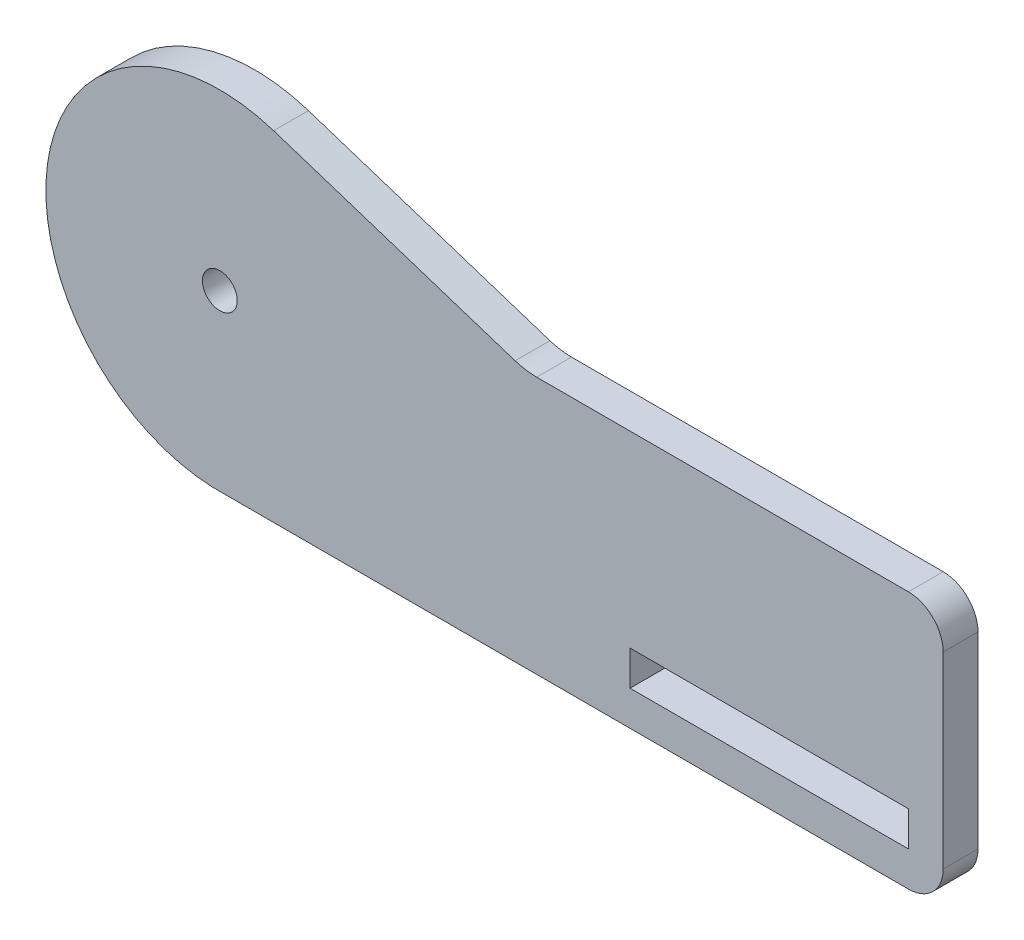
ISO-10303-21;
HEADER;
FILE_DESCRIPTION(('STEP AP214'),'2;1');
FILE_NAME('part.step','',(''),(''),'','','');
FILE_SCHEMA(('AUTOMOTIVE_DESIGN { 1 0 10303 214 1 1 1 1 }'));
ENDSEC;
DATA;
#1=APPLICATION_CONTEXT('core data for automotive mechanical design processes');
#2=APPLICATION_PROTOCOL_DEFINITION('international standard','automotive_design',2000,#1);
#3=PRODUCT_CONTEXT('',#1,'mechanical');
#4=PRODUCT('Part','Part','',(#3));
#5=PRODUCT_RELATED_PRODUCT_CATEGORY('part','',(#4));
#6=PRODUCT_DEFINITION_FORMATION('','',#4);
#7=PRODUCT_DEFINITION_CONTEXT('part definition',#1,'design');
#8=PRODUCT_DEFINITION('design','',#6,#7);
#9=PRODUCT_DEFINITION_SHAPE('','',#8);
#10=(LENGTH_UNIT() NAMED_UNIT(*) SI_UNIT(.MILLI.,.METRE.));
#11=(NAMED_UNIT(*) PLANE_ANGLE_UNIT() SI_UNIT($,.RADIAN.));
#12=(NAMED_UNIT(*) SI_UNIT($,.STERADIAN.) SOLID_ANGLE_UNIT());
#13=UNCERTAINTY_MEASURE_WITH_UNIT(LENGTH_MEASURE(1.E-05),#10,'distance_accuracy_value','');
#14=(GEOMETRIC_REPRESENTATION_CONTEXT(3) GLOBAL_UNCERTAINTY_ASSIGNED_CONTEXT((#13)) GLOBAL_UNIT_ASSIGNED_CONTEXT((#10,
#11,#12)) REPRESENTATION_CONTEXT('',''));
#15=CARTESIAN_POINT('',(0.,0.,0.));
#16=DIRECTION('',(0.,0.,1.));
#17=DIRECTION('',(1.,0.,0.));
#18=AXIS2_PLACEMENT_3D('',#15,#16,#17);
#19=CARTESIAN_POINT('',(78.9414830868261,11.9999983011994,2.5));
#20=DIRECTION('',(5.52135524800601E-08,-0.999999999999999,0.));
#21=DIRECTION('',(0.999999999999999,5.52135524800601E-08,0.));
#22=AXIS2_PLACEMENT_3D('',#19,#20,#21);
#23=PLANE('',#22);
#24=DIRECTION('',(-0.999999999999998,-5.52135524800601E-08,0.));
#25=VECTOR('',#24,1.);
#26=CARTESIAN_POINT('',(78.9414830868261,11.9999983011994,2.5));
#27=LINE('',#26,#25);
#28=CARTESIAN_POINT('',(73.9414834212097,11.9999980251316,2.5));
#29=VERTEX_POINT('',#28);
#30=CARTESIAN_POINT('',(20.5264933913357,11.9999950759003,2.5));
#31=VERTEX_POINT('',#30);
#32=EDGE_CURVE('E160',#29,#31,#27,.T.);
#33=ORIENTED_EDGE('',*,*,#32,.F.);
#34=DIRECTION('',(0.,0.,-1.));
#35=VECTOR('',#34,1.);
#36=CARTESIAN_POINT('',(73.9414834212097,11.9999980251316,2.5));
#37=LINE('',#36,#35);
#38=CARTESIAN_POINT('',(73.9414834212097,11.9999980251316,-2.5));
#39=VERTEX_POINT('',#38);
#40=EDGE_CURVE('E219',#29,#39,#37,.T.);
#41=ORIENTED_EDGE('',*,*,#40,.T.);
#42=DIRECTION('',(-0.999999999999998,-5.52135524800601E-08,0.));
#43=VECTOR('',#42,1.);
#44=CARTESIAN_POINT('',(78.9414830868261,11.9999983011994,-2.5));
#45=LINE('',#44,#43);
#46=CARTESIAN_POINT('',(20.5264933913357,11.9999950759003,-2.5));
#47=VERTEX_POINT('',#46);
#48=EDGE_CURVE('E176',#39,#47,#45,.T.);
#49=ORIENTED_EDGE('',*,*,#48,.T.);
#50=DIRECTION('',(0.,0.,-1.));
#51=VECTOR('',#50,1.);
#52=CARTESIAN_POINT('',(20.5264933913357,11.9999950759003,2.5));
#53=LINE('',#52,#51);
#54=EDGE_CURVE('E194',#47,#31,#53,.F.);
#55=ORIENTED_EDGE('',*,*,#54,.T.);
#56=EDGE_LOOP('',(#33,#41,#49,#55));
#57=FACE_BOUND('',#56,.T.);
#58=ADVANCED_FACE('F30',(#57),#23,.F.);
#59=CARTESIAN_POINT('',(18.9414830868262,11.9999949883862,2.5));
#60=DIRECTION('',(-0.309233270532532,-0.950986216722279,0.));
#61=DIRECTION('',(0.950986216722279,-0.309233270532532,0.));
#62=AXIS2_PLACEMENT_3D('',#59,#60,#61);
#63=PLANE('',#62);
#64=DIRECTION('',(-0.950986216722279,0.309233270532532,0.));
#65=VECTOR('',#64,1.);
#66=CARTESIAN_POINT('',(18.9414830868262,11.9999949883862,2.5));
#67=LINE('',#66,#65);
#68=CARTESIAN_POINT('',(17.4341601338748,12.4901329086775,2.5));
#69=VERTEX_POINT('',#68);
#70=CARTESIAN_POINT('',(-17.2691683086149,23.774653718688,2.5));
#71=VERTEX_POINT('',#70);
#72=EDGE_CURVE('E163',#69,#71,#67,.T.);
#73=ORIENTED_EDGE('',*,*,#72,.F.);
#74=DIRECTION('',(0.,0.,-1.));
#75=VECTOR('',#74,1.);
#76=CARTESIAN_POINT('',(17.4341601338748,12.4901329086775,-2.5));
#77=LINE('',#76,#75);
#78=CARTESIAN_POINT('',(17.4341601338748,12.4901329086775,-2.5));
#79=VERTEX_POINT('',#78);
#80=EDGE_CURVE('E191',#69,#79,#77,.T.);
#81=ORIENTED_EDGE('',*,*,#80,.T.);
#82=DIRECTION('',(-0.950986216722279,0.309233270532532,0.));
#83=VECTOR('',#82,1.);
#84=CARTESIAN_POINT('',(18.9414830868262,11.9999949883862,-2.5));
#85=LINE('',#84,#83);
#86=CARTESIAN_POINT('',(-17.2691683086149,23.774653718688,-2.5));
#87=VERTEX_POINT('',#86);
#88=EDGE_CURVE('E178',#79,#87,#85,.T.);
#89=ORIENTED_EDGE('',*,*,#88,.T.);
#90=DIRECTION('',(0.,0.,-1.));
#91=VECTOR('',#90,1.);
#92=CARTESIAN_POINT('',(-17.2691683086149,23.774653718688,2.5));
#93=LINE('',#92,#91);
#94=EDGE_CURVE('E188',#71,#87,#93,.T.);
#95=ORIENTED_EDGE('',*,*,#94,.F.);
#96=EDGE_LOOP('',(#73,#81,#89,#95));
#97=FACE_BOUND('',#96,.T.);
#98=ADVANCED_FACE('F244',(#97),#63,.F.);
#99=CARTESIAN_POINT('',(-25.0000000783611,-1.69727719292329E-06,2.5));
#100=DIRECTION('',(0.,0.,-1.));
#101=DIRECTION('',(-1.,0.,0.));
#102=AXIS2_PLACEMENT_3D('',#99,#100,#101);
#103=CYLINDRICAL_SURFACE('',#102,25.);
#104=CARTESIAN_POINT('',(-25.0000000783611,-1.69727719292329E-06,-2.5));
#105=DIRECTION('',(0.,0.,1.));
#106=DIRECTION('',(1.,0.,0.));
#107=AXIS2_PLACEMENT_3D('',#104,#105,#106);
#108=CIRCLE('',#107,25.);
#109=CARTESIAN_POINT('',(-26.058513909316,-24.9775826143652,-2.5));
#110=VERTEX_POINT('',#109);
#111=EDGE_CURVE('E180',#87,#110,#108,.T.);
#112=ORIENTED_EDGE('',*,*,#111,.T.);
#113=DIRECTION('',(0.,0.,-1.));
#114=VECTOR('',#113,1.);
#115=CARTESIAN_POINT('',(-26.058513909316,-24.9775826143652,2.5));
#116=LINE('',#115,#114);
#117=CARTESIAN_POINT('',(-26.058513909316,-24.9775826143652,2.5));
#118=VERTEX_POINT('',#117);
#119=EDGE_CURVE('E172',#118,#110,#116,.T.);
#120=ORIENTED_EDGE('',*,*,#119,.F.);
#121=CARTESIAN_POINT('',(-25.0000000783611,-1.69727719292329E-06,2.5));
#122=DIRECTION('',(0.,0.,1.));
#123=DIRECTION('',(1.,0.,0.));
#124=AXIS2_PLACEMENT_3D('',#121,#122,#123);
#125=CIRCLE('',#124,25.);
#126=EDGE_CURVE('E165',#71,#118,#125,.T.);
#127=ORIENTED_EDGE('',*,*,#126,.F.);
#128=ORIENTED_EDGE('',*,*,#94,.T.);
#129=EDGE_LOOP('',(#112,#120,#127,#128));
#130=FACE_BOUND('',#129,.T.);
#131=ADVANCED_FACE('F250',(#130),#103,.T.);
#132=CARTESIAN_POINT('',(-26.058513909316,-24.9775826143652,2.5));
#133=DIRECTION('',(0.000213515089861503,0.999999977205653,0.));
#134=DIRECTION('',(-0.999999977205653,0.000213515089861503,0.));
#135=AXIS2_PLACEMENT_3D('',#132,#133,#134);
#136=PLANE('',#135);
#137=DIRECTION('',(0.999999977205653,-0.000213515089861503,0.));
#138=VECTOR('',#137,1.);
#139=CARTESIAN_POINT('',(-26.058513909316,-24.9775826143652,-2.5));
#140=LINE('',#139,#138);
#141=CARTESIAN_POINT('',(73.9404161218282,-24.9989338953835,-2.5));
#142=VERTEX_POINT('',#141);
#143=EDGE_CURVE('E182',#110,#142,#140,.T.);
#144=ORIENTED_EDGE('',*,*,#143,.T.);
#145=DIRECTION('',(0.,0.,-1.));
#146=VECTOR('',#145,1.);
#147=CARTESIAN_POINT('',(73.9404161218282,-24.9989338953835,2.5));
#148=LINE('',#147,#146);
#149=CARTESIAN_POINT('',(73.9404161218282,-24.9989338953835,2.5));
#150=VERTEX_POINT('',#149);
#151=EDGE_CURVE('E213',#142,#150,#148,.F.);
#152=ORIENTED_EDGE('',*,*,#151,.T.);
#153=DIRECTION('',(0.999999977205653,-0.000213515089861503,0.));
#154=VECTOR('',#153,1.);
#155=CARTESIAN_POINT('',(-26.058513909316,-24.9775826143652,2.5));
#156=LINE('',#155,#154);
#157=EDGE_CURVE('E167',#118,#150,#156,.T.);
#158=ORIENTED_EDGE('',*,*,#157,.F.);
#159=ORIENTED_EDGE('',*,*,#119,.T.);
#160=EDGE_LOOP('',(#144,#152,#158,#159));
#161=FACE_BOUND('',#160,.T.);
#162=ADVANCED_FACE('F294',(#161),#136,.F.);
#163=CARTESIAN_POINT('',(78.9414836972775,-25.0000016988006,2.5));
#164=DIRECTION('',(-1.,0.,0.));
#165=DIRECTION('',(0.,0.,1.));
#166=AXIS2_PLACEMENT_3D('',#163,#164,#165);
#167=PLANE('',#166);
#168=DIRECTION('',(0.,1.,0.));
#169=VECTOR('',#168,1.);
#170=CARTESIAN_POINT('',(78.9414836972775,-25.0000016988006,2.5));
#171=LINE('',#170,#169);
#172=CARTESIAN_POINT('',(78.9414836972775,-19.9989340093552,2.5));
#173=VERTEX_POINT('',#172);
#174=CARTESIAN_POINT('',(78.9414836972775,-1.69880061571916E-06,2.5));
#175=VERTEX_POINT('',#174);
#176=EDGE_CURVE('E170',#173,#175,#171,.T.);
#177=ORIENTED_EDGE('',*,*,#176,.F.);
#178=DIRECTION('',(0.,0.,-1.));
#179=VECTOR('',#178,1.);
#180=CARTESIAN_POINT('',(78.9414836972775,-19.9989340093552,2.5));
#181=LINE('',#180,#179);
#182=CARTESIAN_POINT('',(78.9414836972775,-19.9989340093552,-2.5));
#183=VERTEX_POINT('',#182);
#184=EDGE_CURVE('E206',#173,#183,#181,.T.);
#185=ORIENTED_EDGE('',*,*,#184,.T.);
#186=DIRECTION('',(0.,1.,0.));
#187=VECTOR('',#186,1.);
#188=CARTESIAN_POINT('',(78.9414836972775,-25.0000016988006,-2.5));
#189=LINE('',#188,#187);
#190=CARTESIAN_POINT('',(78.9414836972775,-1.69880061571916E-06,-2.5));
#191=VERTEX_POINT('',#190);
#192=EDGE_CURVE('E161',#183,#191,#189,.T.);
#193=ORIENTED_EDGE('',*,*,#192,.T.);
#194=DIRECTION('',(-5.08709532831553E-08,0.999999999999999,0.));
#195=VECTOR('',#194,1.);
#196=CARTESIAN_POINT('',(78.9414836972775,-1.69880061571916E-06,-2.5));
#197=LINE('',#196,#195);
#198=CARTESIAN_POINT('',(78.9414833411809,6.99999802513161,-2.5));
#199=VERTEX_POINT('',#198);
#200=EDGE_CURVE('E173',#191,#199,#197,.T.);
#201=ORIENTED_EDGE('',*,*,#200,.T.);
#202=DIRECTION('',(0.,0.,-1.));
#203=VECTOR('',#202,1.);
#204=CARTESIAN_POINT('',(78.9414836972775,6.99999802513163,2.5));
#205=LINE('',#204,#203);
#206=CARTESIAN_POINT('',(78.9414833411809,6.99999802513161,2.5));
#207=VERTEX_POINT('',#206);
#208=EDGE_CURVE('E202',#199,#207,#205,.F.);
#209=ORIENTED_EDGE('',*,*,#208,.T.);
#210=DIRECTION('',(-5.08709532831553E-08,0.999999999999999,0.));
#211=VECTOR('',#210,1.);
#212=CARTESIAN_POINT('',(78.9414836972775,-1.69880061571916E-06,2.5));
#213=LINE('',#212,#211);
#214=EDGE_CURVE('E157',#175,#207,#213,.T.);
#215=ORIENTED_EDGE('',*,*,#214,.F.);
#216=EDGE_LOOP('',(#177,#185,#193,#201,#209,#215));
#217=FACE_BOUND('',#216,.T.);
#218=ADVANCED_FACE('F274',(#217),#167,.F.);
#219=CARTESIAN_POINT('',(-25.0000000783611,-1.69727719292329E-06,2.5));
#220=DIRECTION('',(0.,0.,1.));
#221=DIRECTION('',(1.,0.,0.));
#222=AXIS2_PLACEMENT_3D('',#219,#220,#221);
#223=PLANE('',#222);
#224=DIRECTION('',(0.,1.,0.));
#225=VECTOR('',#224,1.);
#226=CARTESIAN_POINT('',(73.9414836972775,-19.9989340093552,2.5));
#227=LINE('',#226,#225);
#228=CARTESIAN_POINT('',(73.9414836972775,-19.9989340093552,2.5));
#229=VERTEX_POINT('',#228);
#230=CARTESIAN_POINT('',(73.9414836972775,-14.9989340093552,2.5));
#231=VERTEX_POINT('',#230);
#232=EDGE_CURVE('E45',#229,#231,#227,.T.);
#233=ORIENTED_EDGE('',*,*,#232,.F.);
#234=DIRECTION('',(1.,0.,0.));
#235=VECTOR('',#234,1.);
#236=CARTESIAN_POINT('',(73.9414836972775,-19.9989340093552,2.5));
#237=LINE('',#236,#235);
#238=CARTESIAN_POINT('',(33.9414836972775,-19.9989340093552,2.5));
#239=VERTEX_POINT('',#238);
#240=EDGE_CURVE('E144',#239,#229,#237,.T.);
#241=ORIENTED_EDGE('',*,*,#240,.F.);
#242=DIRECTION('',(0.,-1.,0.));
#243=VECTOR('',#242,1.);
#244=CARTESIAN_POINT('',(33.9414836972775,-19.9989340093552,2.5));
#245=LINE('',#244,#243);
#246=CARTESIAN_POINT('',(33.9414836972775,-14.9989340093552,2.5));
#247=VERTEX_POINT('',#246);
#248=EDGE_CURVE('E128',#247,#239,#245,.T.);
#249=ORIENTED_EDGE('',*,*,#248,.F.);
#250=DIRECTION('',(-1.,0.,0.));
#251=VECTOR('',#250,1.);
#252=CARTESIAN_POINT('',(33.9414836972775,-14.9989340093552,2.5));
#253=LINE('',#252,#251);
#254=EDGE_CURVE('E137',#231,#247,#253,.T.);
#255=ORIENTED_EDGE('',*,*,#254,.F.);
#256=EDGE_LOOP('',(#233,#241,#249,#255));
#257=FACE_BOUND('',#256,.T.);
#258=CARTESIAN_POINT('',(-25.0000000783611,-1.69727719292329E-06,2.5));
#259=DIRECTION('',(0.,0.,1.));
#260=DIRECTION('',(1.,0.,0.));
#261=AXIS2_PLACEMENT_3D('',#258,#259,#260);
#262=CIRCLE('',#261,2.5);
#263=CARTESIAN_POINT('',(-22.5000000783611,-1.69727719292329E-06,2.5));
#264=VERTEX_POINT('',#263);
#265=EDGE_CURVE('E151',#264,#264,#262,.T.);
#266=ORIENTED_EDGE('',*,*,#265,.F.);
#267=EDGE_LOOP('',(#266));
#268=FACE_BOUND('',#267,.T.);
#269=ORIENTED_EDGE('',*,*,#157,.T.);
#270=CARTESIAN_POINT('',(73.9414836972775,-19.9989340093552,2.5));
#271=DIRECTION('',(0.,0.,1.));
#272=DIRECTION('',(1.,0.,0.));
#273=AXIS2_PLACEMENT_3D('',#270,#271,#272);
#274=CIRCLE('',#273,5.);
#275=EDGE_CURVE('E217',#150,#173,#274,.T.);
#276=ORIENTED_EDGE('',*,*,#275,.T.);
#277=ORIENTED_EDGE('',*,*,#176,.T.);
#278=ORIENTED_EDGE('',*,*,#214,.T.);
#279=CARTESIAN_POINT('',(73.9414836972775,6.99999802513163,2.5));
#280=DIRECTION('',(0.,0.,1.));
#281=DIRECTION('',(1.,0.,0.));
#282=AXIS2_PLACEMENT_3D('',#279,#280,#281);
#283=CIRCLE('',#282,5.);
#284=EDGE_CURVE('E215',#207,#29,#283,.T.);
#285=ORIENTED_EDGE('',*,*,#284,.T.);
#286=ORIENTED_EDGE('',*,*,#32,.T.);
#287=CARTESIAN_POINT('',(20.5264928392001,21.9999950759003,2.5));
#288=DIRECTION('',(0.,0.,1.));
#289=DIRECTION('',(1.,0.,0.));
#290=AXIS2_PLACEMENT_3D('',#287,#288,#289);
#291=CIRCLE('',#290,10.);
#292=EDGE_CURVE('E200',#31,#69,#291,.F.);
#293=ORIENTED_EDGE('',*,*,#292,.T.);
#294=ORIENTED_EDGE('',*,*,#72,.T.);
#295=ORIENTED_EDGE('',*,*,#126,.T.);
#296=EDGE_LOOP('',(#269,#276,#277,#278,#285,#286,#293,#294,#295));
#297=FACE_BOUND('',#296,.T.);
#298=ADVANCED_FACE('F141',(#257,#268,#297),#223,.T.);
#299=CARTESIAN_POINT('',(-25.0000000783611,-1.69727719292329E-06,-2.5));
#300=DIRECTION('',(0.,0.,1.));
#301=DIRECTION('',(1.,0.,0.));
#302=AXIS2_PLACEMENT_3D('',#299,#300,#301);
#303=PLANE('',#302);
#304=DIRECTION('',(1.,0.,0.));
#305=VECTOR('',#304,1.);
#306=CARTESIAN_POINT('',(-25.0000000783611,-19.9989340093552,-2.5));
#307=LINE('',#306,#305);
#308=CARTESIAN_POINT('',(33.9414836972775,-19.9989340093552,-2.5));
#309=VERTEX_POINT('',#308);
#310=CARTESIAN_POINT('',(73.9414836972775,-19.9989340093552,-2.5));
#311=VERTEX_POINT('',#310);
#312=EDGE_CURVE('E38',#309,#311,#307,.T.);
#313=ORIENTED_EDGE('',*,*,#312,.T.);
#314=DIRECTION('',(0.,1.,0.));
#315=VECTOR('',#314,1.);
#316=CARTESIAN_POINT('',(73.9414836972775,-1.69727719292329E-06,-2.5));
#317=LINE('',#316,#315);
#318=CARTESIAN_POINT('',(73.9414836972775,-14.9989340093552,-2.5));
#319=VERTEX_POINT('',#318);
#320=EDGE_CURVE('E11',#311,#319,#317,.T.);
#321=ORIENTED_EDGE('',*,*,#320,.T.);
#322=DIRECTION('',(-1.,0.,0.));
#323=VECTOR('',#322,1.);
#324=CARTESIAN_POINT('',(-25.0000000783611,-14.9989340093552,-2.5));
#325=LINE('',#324,#323);
#326=CARTESIAN_POINT('',(33.9414836972775,-14.9989340093552,-2.5));
#327=VERTEX_POINT('',#326);
#328=EDGE_CURVE('E222',#319,#327,#325,.T.);
#329=ORIENTED_EDGE('',*,*,#328,.T.);
#330=DIRECTION('',(0.,-1.,0.));
#331=VECTOR('',#330,1.);
#332=CARTESIAN_POINT('',(33.9414836972775,-1.69727719292329E-06,-2.5));
#333=LINE('',#332,#331);
#334=EDGE_CURVE('E131',#327,#309,#333,.T.);
#335=ORIENTED_EDGE('',*,*,#334,.T.);
#336=EDGE_LOOP('',(#313,#321,#329,#335));
#337=FACE_BOUND('',#336,.T.);
#338=CARTESIAN_POINT('',(-25.0000000783611,-1.69727719292329E-06,-2.5));
#339=DIRECTION('',(0.,0.,1.));
#340=DIRECTION('',(1.,0.,0.));
#341=AXIS2_PLACEMENT_3D('',#338,#339,#340);
#342=CIRCLE('',#341,2.5);
#343=CARTESIAN_POINT('',(-22.5000000783611,-1.69727719292329E-06,-2.5));
#344=VERTEX_POINT('',#343);
#345=EDGE_CURVE('E156',#344,#344,#342,.T.);
#346=ORIENTED_EDGE('',*,*,#345,.T.);
#347=EDGE_LOOP('',(#346));
#348=FACE_BOUND('',#347,.T.);
#349=ORIENTED_EDGE('',*,*,#192,.F.);
#350=CARTESIAN_POINT('',(73.9414836972775,-19.9989340093552,-2.5));
#351=DIRECTION('',(0.,0.,1.));
#352=DIRECTION('',(1.,0.,0.));
#353=AXIS2_PLACEMENT_3D('',#350,#351,#352);
#354=CIRCLE('',#353,5.);
#355=EDGE_CURVE('E211',#183,#142,#354,.F.);
#356=ORIENTED_EDGE('',*,*,#355,.T.);
#357=ORIENTED_EDGE('',*,*,#143,.F.);
#358=ORIENTED_EDGE('',*,*,#111,.F.);
#359=ORIENTED_EDGE('',*,*,#88,.F.);
#360=CARTESIAN_POINT('',(20.5264928392001,21.9999950759003,-2.5));
#361=DIRECTION('',(0.,0.,1.));
#362=DIRECTION('',(1.,0.,0.));
#363=AXIS2_PLACEMENT_3D('',#360,#361,#362);
#364=CIRCLE('',#363,10.);
#365=EDGE_CURVE('E197',#79,#47,#364,.T.);
#366=ORIENTED_EDGE('',*,*,#365,.T.);
#367=ORIENTED_EDGE('',*,*,#48,.F.);
#368=CARTESIAN_POINT('',(73.9414836972775,6.99999802513163,-2.5));
#369=DIRECTION('',(0.,0.,1.));
#370=DIRECTION('',(1.,0.,0.));
#371=AXIS2_PLACEMENT_3D('',#368,#369,#370);
#372=CIRCLE('',#371,5.);
#373=EDGE_CURVE('E209',#39,#199,#372,.F.);
#374=ORIENTED_EDGE('',*,*,#373,.T.);
#375=ORIENTED_EDGE('',*,*,#200,.F.);
#376=EDGE_LOOP('',(#349,#356,#357,#358,#359,#366,#367,#374,#375));
#377=FACE_BOUND('',#376,.T.);
#378=ADVANCED_FACE('F226',(#337,#348,#377),#303,.F.);
#379=CARTESIAN_POINT('',(20.5264928392001,21.9999950759003,2.5));
#380=DIRECTION('',(0.,0.,1.));
#381=DIRECTION('',(1.,0.,0.));
#382=AXIS2_PLACEMENT_3D('',#379,#380,#381);
#383=CYLINDRICAL_SURFACE('',#382,10.);
#384=ORIENTED_EDGE('',*,*,#292,.F.);
#385=ORIENTED_EDGE('',*,*,#54,.F.);
#386=ORIENTED_EDGE('',*,*,#365,.F.);
#387=ORIENTED_EDGE('',*,*,#80,.F.);
#388=EDGE_LOOP('',(#384,#385,#386,#387));
#389=FACE_BOUND('',#388,.T.);
#390=ADVANCED_FACE('F256',(#389),#383,.F.);
#391=CARTESIAN_POINT('',(-25.0000000783611,-1.69727719292329E-06,-7.5));
#392=DIRECTION('',(0.,0.,1.));
#393=DIRECTION('',(1.,0.,0.));
#394=AXIS2_PLACEMENT_3D('',#391,#392,#393);
#395=CYLINDRICAL_SURFACE('',#394,2.5);
#396=ORIENTED_EDGE('',*,*,#265,.T.);
#397=EDGE_LOOP('',(#396));
#398=FACE_BOUND('',#397,.T.);
#399=ORIENTED_EDGE('',*,*,#345,.F.);
#400=EDGE_LOOP('',(#399));
#401=FACE_BOUND('',#400,.T.);
#402=ADVANCED_FACE('F258',(#398,#401),#395,.F.);
#403=CARTESIAN_POINT('',(73.9414836972775,-19.9989340093552,2.5));
#404=DIRECTION('',(0.,0.,-1.));
#405=DIRECTION('',(-1.,0.,0.));
#406=AXIS2_PLACEMENT_3D('',#403,#404,#405);
#407=CYLINDRICAL_SURFACE('',#406,5.);
#408=ORIENTED_EDGE('',*,*,#275,.F.);
#409=ORIENTED_EDGE('',*,*,#151,.F.);
#410=ORIENTED_EDGE('',*,*,#355,.F.);
#411=ORIENTED_EDGE('',*,*,#184,.F.);
#412=EDGE_LOOP('',(#408,#409,#410,#411));
#413=FACE_BOUND('',#412,.T.);
#414=ADVANCED_FACE('F239',(#413),#407,.T.);
#415=CARTESIAN_POINT('',(73.9414836972775,6.99999802513163,2.5));
#416=DIRECTION('',(0.,0.,-1.));
#417=DIRECTION('',(-1.,0.,0.));
#418=AXIS2_PLACEMENT_3D('',#415,#416,#417);
#419=CYLINDRICAL_SURFACE('',#418,5.);
#420=ORIENTED_EDGE('',*,*,#284,.F.);
#421=ORIENTED_EDGE('',*,*,#208,.F.);
#422=ORIENTED_EDGE('',*,*,#373,.F.);
#423=ORIENTED_EDGE('',*,*,#40,.F.);
#424=EDGE_LOOP('',(#420,#421,#422,#423));
#425=FACE_BOUND('',#424,.T.);
#426=ADVANCED_FACE('F32',(#425),#419,.T.);
#427=CARTESIAN_POINT('',(73.9414836972775,-19.9989340093552,-7.5));
#428=DIRECTION('',(1.,0.,0.));
#429=DIRECTION('',(0.,0.,-1.));
#430=AXIS2_PLACEMENT_3D('',#427,#428,#429);
#431=PLANE('',#430);
#432=DIRECTION('',(0.,0.,1.));
#433=VECTOR('',#432,1.);
#434=CARTESIAN_POINT('',(73.9414836972775,-19.9989340093552,-7.5));
#435=LINE('',#434,#433);
#436=EDGE_CURVE('E149',#311,#229,#435,.T.);
#437=ORIENTED_EDGE('',*,*,#436,.T.);
#438=ORIENTED_EDGE('',*,*,#232,.T.);
#439=DIRECTION('',(0.,0.,1.));
#440=VECTOR('',#439,1.);
#441=CARTESIAN_POINT('',(73.9414836972775,-14.9989340093552,-7.5));
#442=LINE('',#441,#440);
#443=EDGE_CURVE('E134',#319,#231,#442,.T.);
#444=ORIENTED_EDGE('',*,*,#443,.F.);
#445=ORIENTED_EDGE('',*,*,#320,.F.);
#446=EDGE_LOOP('',(#437,#438,#444,#445));
#447=FACE_BOUND('',#446,.T.);
#448=ADVANCED_FACE('F231',(#447),#431,.F.);
#449=CARTESIAN_POINT('',(73.9414836972775,-19.9989340093552,-7.5));
#450=DIRECTION('',(0.,-1.,0.));
#451=DIRECTION('',(0.,0.,-1.));
#452=AXIS2_PLACEMENT_3D('',#449,#450,#451);
#453=PLANE('',#452);
#454=DIRECTION('',(0.,0.,1.));
#455=VECTOR('',#454,1.);
#456=CARTESIAN_POINT('',(33.9414836972775,-19.9989340093552,-7.5));
#457=LINE('',#456,#455);
#458=EDGE_CURVE('E133',#309,#239,#457,.T.);
#459=ORIENTED_EDGE('',*,*,#458,.T.);
#460=ORIENTED_EDGE('',*,*,#240,.T.);
#461=ORIENTED_EDGE('',*,*,#436,.F.);
#462=ORIENTED_EDGE('',*,*,#312,.F.);
#463=EDGE_LOOP('',(#459,#460,#461,#462));
#464=FACE_BOUND('',#463,.T.);
#465=ADVANCED_FACE('F230',(#464),#453,.F.);
#466=CARTESIAN_POINT('',(33.9414836972775,-19.9989340093552,-7.5));
#467=DIRECTION('',(-1.,0.,0.));
#468=DIRECTION('',(0.,0.,1.));
#469=AXIS2_PLACEMENT_3D('',#466,#467,#468);
#470=PLANE('',#469);
#471=DIRECTION('',(0.,0.,1.));
#472=VECTOR('',#471,1.);
#473=CARTESIAN_POINT('',(33.9414836972775,-14.9989340093552,-7.5));
#474=LINE('',#473,#472);
#475=EDGE_CURVE('E53',#327,#247,#474,.T.);
#476=ORIENTED_EDGE('',*,*,#475,.T.);
#477=ORIENTED_EDGE('',*,*,#248,.T.);
#478=ORIENTED_EDGE('',*,*,#458,.F.);
#479=ORIENTED_EDGE('',*,*,#334,.F.);
#480=EDGE_LOOP('',(#476,#477,#478,#479));
#481=FACE_BOUND('',#480,.T.);
#482=ADVANCED_FACE('F125',(#481),#470,.F.);
#483=CARTESIAN_POINT('',(33.9414836972775,-14.9989340093552,-7.5));
#484=DIRECTION('',(0.,1.,0.));
#485=DIRECTION('',(0.,0.,1.));
#486=AXIS2_PLACEMENT_3D('',#483,#484,#485);
#487=PLANE('',#486);
#488=ORIENTED_EDGE('',*,*,#443,.T.);
#489=ORIENTED_EDGE('',*,*,#254,.T.);
#490=ORIENTED_EDGE('',*,*,#475,.F.);
#491=ORIENTED_EDGE('',*,*,#328,.F.);
#492=EDGE_LOOP('',(#488,#489,#490,#491));
#493=FACE_BOUND('',#492,.T.);
#494=ADVANCED_FACE('F138',(#493),#487,.F.);
#495=CLOSED_SHELL('',(#58,#98,#131,#162,#218,#298,#378,#390,#402,#414,#426,#448,#465,#482,#494));
#496=MANIFOLD_SOLID_BREP('B2',#495);
#497=ADVANCED_BREP_SHAPE_REPRESENTATION('',(#18,#496),#14);
#498=SHAPE_DEFINITION_REPRESENTATION(#9,#497);
ENDSEC;
END-ISO-10303-21;
